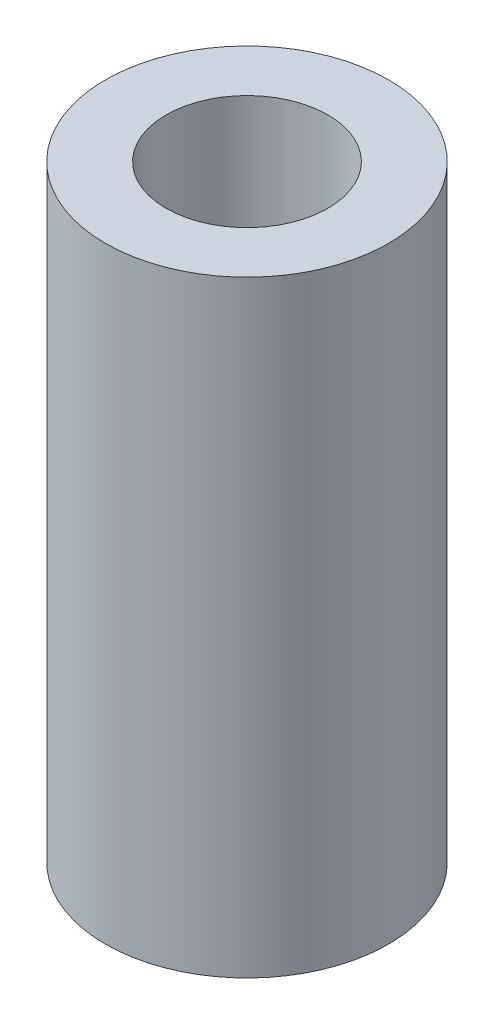
ISO-10303-21;
HEADER;
FILE_DESCRIPTION(('STEP AP214'),'2;1');
FILE_NAME('part.step','',(''),(''),'','','');
FILE_SCHEMA(('AUTOMOTIVE_DESIGN { 1 0 10303 214 1 1 1 1 }'));
ENDSEC;
DATA;
#1=APPLICATION_CONTEXT('core data for automotive mechanical design processes');
#2=APPLICATION_PROTOCOL_DEFINITION('international standard','automotive_design',2000,#1);
#3=PRODUCT_CONTEXT('',#1,'mechanical');
#4=PRODUCT('Part','Part','',(#3));
#5=PRODUCT_RELATED_PRODUCT_CATEGORY('part','',(#4));
#6=PRODUCT_DEFINITION_FORMATION('','',#4);
#7=PRODUCT_DEFINITION_CONTEXT('part definition',#1,'design');
#8=PRODUCT_DEFINITION('design','',#6,#7);
#9=PRODUCT_DEFINITION_SHAPE('','',#8);
#10=(LENGTH_UNIT() NAMED_UNIT(*) SI_UNIT(.MILLI.,.METRE.));
#11=(NAMED_UNIT(*) PLANE_ANGLE_UNIT() SI_UNIT($,.RADIAN.));
#12=(NAMED_UNIT(*) SI_UNIT($,.STERADIAN.) SOLID_ANGLE_UNIT());
#13=UNCERTAINTY_MEASURE_WITH_UNIT(LENGTH_MEASURE(1.E-05),#10,'distance_accuracy_value','');
#14=(GEOMETRIC_REPRESENTATION_CONTEXT(3) GLOBAL_UNCERTAINTY_ASSIGNED_CONTEXT((#13)) GLOBAL_UNIT_ASSIGNED_CONTEXT((#10,
#11,#12)) REPRESENTATION_CONTEXT('',''));
#15=CARTESIAN_POINT('',(0.,0.,0.));
#16=DIRECTION('',(0.,0.,1.));
#17=DIRECTION('',(1.,0.,0.));
#18=AXIS2_PLACEMENT_3D('',#15,#16,#17);
#19=CARTESIAN_POINT('',(0.,15.,0.));
#20=DIRECTION('',(0.,1.,0.));
#21=DIRECTION('',(0.,0.,1.));
#22=AXIS2_PLACEMENT_3D('',#19,#20,#21);
#23=PLANE('',#22);
#24=CARTESIAN_POINT('',(0.,15.,0.));
#25=DIRECTION('',(0.,1.,0.));
#26=DIRECTION('',(0.,0.,1.));
#27=AXIS2_PLACEMENT_3D('',#24,#25,#26);
#28=CIRCLE('',#27,3.5);
#29=CARTESIAN_POINT('',(0.,15.,3.5));
#30=VERTEX_POINT('',#29);
#31=EDGE_CURVE('E10',#30,#30,#28,.T.);
#32=ORIENTED_EDGE('',*,*,#31,.T.);
#33=EDGE_LOOP('',(#32));
#34=FACE_BOUND('',#33,.T.);
#35=CARTESIAN_POINT('',(0.,15.,0.));
#36=DIRECTION('',(0.,1.,0.));
#37=DIRECTION('',(0.,0.,1.));
#38=AXIS2_PLACEMENT_3D('',#35,#36,#37);
#39=CIRCLE('',#38,2.);
#40=CARTESIAN_POINT('',(0.,15.,2.));
#41=VERTEX_POINT('',#40);
#42=EDGE_CURVE('E42',#41,#41,#39,.T.);
#43=ORIENTED_EDGE('',*,*,#42,.F.);
#44=EDGE_LOOP('',(#43));
#45=FACE_BOUND('',#44,.T.);
#46=ADVANCED_FACE('F31',(#34,#45),#23,.T.);
#47=CARTESIAN_POINT('',(0.,0.,0.));
#48=DIRECTION('',(0.,1.,0.));
#49=DIRECTION('',(0.,0.,1.));
#50=AXIS2_PLACEMENT_3D('',#47,#48,#49);
#51=PLANE('',#50);
#52=CARTESIAN_POINT('',(0.,0.,0.));
#53=DIRECTION('',(0.,1.,0.));
#54=DIRECTION('',(0.,0.,1.));
#55=AXIS2_PLACEMENT_3D('',#52,#53,#54);
#56=CIRCLE('',#55,3.5);
#57=CARTESIAN_POINT('',(0.,0.,3.5));
#58=VERTEX_POINT('',#57);
#59=EDGE_CURVE('E35',#58,#58,#56,.T.);
#60=ORIENTED_EDGE('',*,*,#59,.F.);
#61=EDGE_LOOP('',(#60));
#62=FACE_BOUND('',#61,.T.);
#63=CARTESIAN_POINT('',(0.,0.,0.));
#64=DIRECTION('',(0.,1.,0.));
#65=DIRECTION('',(0.,0.,1.));
#66=AXIS2_PLACEMENT_3D('',#63,#64,#65);
#67=CIRCLE('',#66,2.);
#68=CARTESIAN_POINT('',(0.,0.,2.));
#69=VERTEX_POINT('',#68);
#70=EDGE_CURVE('E44',#69,#69,#67,.T.);
#71=ORIENTED_EDGE('',*,*,#70,.T.);
#72=EDGE_LOOP('',(#71));
#73=FACE_BOUND('',#72,.T.);
#74=ADVANCED_FACE('F54',(#62,#73),#51,.F.);
#75=CARTESIAN_POINT('',(0.,15.,0.));
#76=DIRECTION('',(0.,-1.,0.));
#77=DIRECTION('',(0.,0.,-1.));
#78=AXIS2_PLACEMENT_3D('',#75,#76,#77);
#79=CYLINDRICAL_SURFACE('',#78,3.5);
#80=ORIENTED_EDGE('',*,*,#31,.F.);
#81=EDGE_LOOP('',(#80));
#82=FACE_BOUND('',#81,.T.);
#83=ORIENTED_EDGE('',*,*,#59,.T.);
#84=EDGE_LOOP('',(#83));
#85=FACE_BOUND('',#84,.T.);
#86=ADVANCED_FACE('F33',(#82,#85),#79,.T.);
#87=CARTESIAN_POINT('',(0.,15.,0.));
#88=DIRECTION('',(0.,-1.,0.));
#89=DIRECTION('',(0.,0.,-1.));
#90=AXIS2_PLACEMENT_3D('',#87,#88,#89);
#91=CYLINDRICAL_SURFACE('',#90,2.);
#92=ORIENTED_EDGE('',*,*,#42,.T.);
#93=EDGE_LOOP('',(#92));
#94=FACE_BOUND('',#93,.T.);
#95=ORIENTED_EDGE('',*,*,#70,.F.);
#96=EDGE_LOOP('',(#95));
#97=FACE_BOUND('',#96,.T.);
#98=ADVANCED_FACE('F50',(#94,#97),#91,.F.);
#99=CLOSED_SHELL('',(#46,#74,#86,#98));
#100=MANIFOLD_SOLID_BREP('B2',#99);
#101=ADVANCED_BREP_SHAPE_REPRESENTATION('',(#18,#100),#14);
#102=SHAPE_DEFINITION_REPRESENTATION(#9,#101);
ENDSEC;
END-ISO-10303-21;
